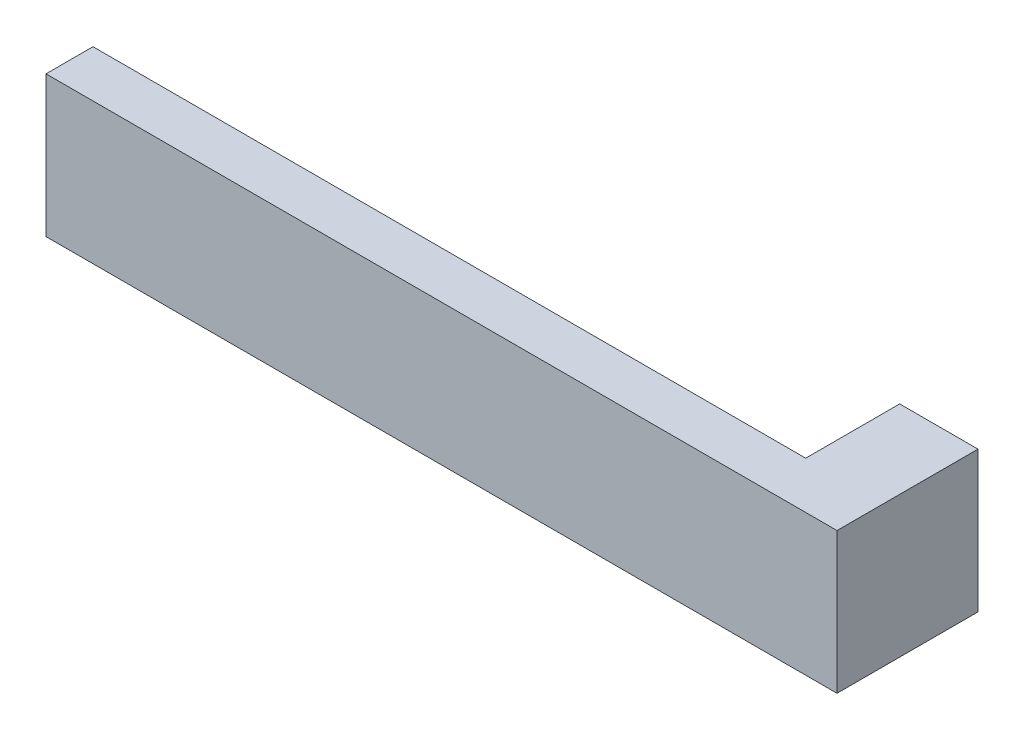
ISO-10303-21;
HEADER;
FILE_DESCRIPTION(('STEP AP214'),'2;1');
FILE_NAME('part.step','',(''),(''),'','','');
FILE_SCHEMA(('AUTOMOTIVE_DESIGN { 1 0 10303 214 1 1 1 1 }'));
ENDSEC;
DATA;
#1=APPLICATION_CONTEXT('core data for automotive mechanical design processes');
#2=APPLICATION_PROTOCOL_DEFINITION('international standard','automotive_design',2000,#1);
#3=PRODUCT_CONTEXT('',#1,'mechanical');
#4=PRODUCT('Part','Part','',(#3));
#5=PRODUCT_RELATED_PRODUCT_CATEGORY('part','',(#4));
#6=PRODUCT_DEFINITION_FORMATION('','',#4);
#7=PRODUCT_DEFINITION_CONTEXT('part definition',#1,'design');
#8=PRODUCT_DEFINITION('design','',#6,#7);
#9=PRODUCT_DEFINITION_SHAPE('','',#8);
#10=(LENGTH_UNIT() NAMED_UNIT(*) SI_UNIT(.MILLI.,.METRE.));
#11=(NAMED_UNIT(*) PLANE_ANGLE_UNIT() SI_UNIT($,.RADIAN.));
#12=(NAMED_UNIT(*) SI_UNIT($,.STERADIAN.) SOLID_ANGLE_UNIT());
#13=UNCERTAINTY_MEASURE_WITH_UNIT(LENGTH_MEASURE(1.E-05),#10,'distance_accuracy_value','');
#14=(GEOMETRIC_REPRESENTATION_CONTEXT(3) GLOBAL_UNCERTAINTY_ASSIGNED_CONTEXT((#13)) GLOBAL_UNIT_ASSIGNED_CONTEXT((#10,
#11,#12)) REPRESENTATION_CONTEXT('',''));
#15=CARTESIAN_POINT('',(0.,0.,0.));
#16=DIRECTION('',(0.,0.,1.));
#17=DIRECTION('',(1.,0.,0.));
#18=AXIS2_PLACEMENT_3D('',#15,#16,#17);
#19=CARTESIAN_POINT('',(-11.9274285384694,9.,21.));
#20=DIRECTION('',(0.,0.,-1.));
#21=DIRECTION('',(-1.,0.,0.));
#22=AXIS2_PLACEMENT_3D('',#19,#20,#21);
#23=PLANE('',#22);
#24=DIRECTION('',(1.,0.,0.));
#25=VECTOR('',#24,1.);
#26=CARTESIAN_POINT('',(-11.9274285384694,0.,21.));
#27=LINE('',#26,#25);
#28=CARTESIAN_POINT('',(-11.9274285384694,0.,21.));
#29=VERTEX_POINT('',#28);
#30=CARTESIAN_POINT('',(38.5725714615306,0.,21.));
#31=VERTEX_POINT('',#30);
#32=EDGE_CURVE('E134',#29,#31,#27,.T.);
#33=ORIENTED_EDGE('',*,*,#32,.T.);
#34=DIRECTION('',(0.,-1.,0.));
#35=VECTOR('',#34,1.);
#36=CARTESIAN_POINT('',(38.5725714615306,9.,21.));
#37=LINE('',#36,#35);
#38=CARTESIAN_POINT('',(38.5725714615306,9.,21.));
#39=VERTEX_POINT('',#38);
#40=EDGE_CURVE('E11',#39,#31,#37,.T.);
#41=ORIENTED_EDGE('',*,*,#40,.F.);
#42=DIRECTION('',(1.,0.,0.));
#43=VECTOR('',#42,1.);
#44=CARTESIAN_POINT('',(-11.9274285384694,9.,21.));
#45=LINE('',#44,#43);
#46=CARTESIAN_POINT('',(-11.9274285384694,9.,21.));
#47=VERTEX_POINT('',#46);
#48=EDGE_CURVE('E150',#47,#39,#45,.T.);
#49=ORIENTED_EDGE('',*,*,#48,.F.);
#50=DIRECTION('',(0.,-1.,0.));
#51=VECTOR('',#50,1.);
#52=CARTESIAN_POINT('',(-11.9274285384694,9.,21.));
#53=LINE('',#52,#51);
#54=EDGE_CURVE('E130',#47,#29,#53,.T.);
#55=ORIENTED_EDGE('',*,*,#54,.T.);
#56=EDGE_LOOP('',(#33,#41,#49,#55));
#57=FACE_BOUND('',#56,.T.);
#58=ADVANCED_FACE('F45',(#57),#23,.F.);
#59=CARTESIAN_POINT('',(38.5725714615306,9.,21.));
#60=DIRECTION('',(-1.,0.,0.));
#61=DIRECTION('',(0.,0.,1.));
#62=AXIS2_PLACEMENT_3D('',#59,#60,#61);
#63=PLANE('',#62);
#64=DIRECTION('',(0.,0.,-1.));
#65=VECTOR('',#64,1.);
#66=CARTESIAN_POINT('',(38.5725714615306,0.,21.));
#67=LINE('',#66,#65);
#68=CARTESIAN_POINT('',(38.5725714615306,0.,12.));
#69=VERTEX_POINT('',#68);
#70=EDGE_CURVE('E138',#31,#69,#67,.T.);
#71=ORIENTED_EDGE('',*,*,#70,.T.);
#72=DIRECTION('',(0.,-1.,0.));
#73=VECTOR('',#72,1.);
#74=CARTESIAN_POINT('',(38.5725714615306,9.,12.));
#75=LINE('',#74,#73);
#76=CARTESIAN_POINT('',(38.5725714615306,9.,12.));
#77=VERTEX_POINT('',#76);
#78=EDGE_CURVE('E54',#77,#69,#75,.T.);
#79=ORIENTED_EDGE('',*,*,#78,.F.);
#80=DIRECTION('',(0.,0.,-1.));
#81=VECTOR('',#80,1.);
#82=CARTESIAN_POINT('',(38.5725714615306,9.,21.));
#83=LINE('',#82,#81);
#84=EDGE_CURVE('E99',#39,#77,#83,.T.);
#85=ORIENTED_EDGE('',*,*,#84,.F.);
#86=ORIENTED_EDGE('',*,*,#40,.T.);
#87=EDGE_LOOP('',(#71,#79,#85,#86));
#88=FACE_BOUND('',#87,.T.);
#89=ADVANCED_FACE('F178',(#88),#63,.F.);
#90=CARTESIAN_POINT('',(38.5725714615306,9.,12.));
#91=DIRECTION('',(0.,0.,1.));
#92=DIRECTION('',(1.,0.,0.));
#93=AXIS2_PLACEMENT_3D('',#90,#91,#92);
#94=PLANE('',#93);
#95=DIRECTION('',(-1.,0.,0.));
#96=VECTOR('',#95,1.);
#97=CARTESIAN_POINT('',(38.5725714615306,0.,12.));
#98=LINE('',#97,#96);
#99=CARTESIAN_POINT('',(33.5725714615306,0.,12.));
#100=VERTEX_POINT('',#99);
#101=EDGE_CURVE('E141',#69,#100,#98,.T.);
#102=ORIENTED_EDGE('',*,*,#101,.T.);
#103=DIRECTION('',(0.,-1.,0.));
#104=VECTOR('',#103,1.);
#105=CARTESIAN_POINT('',(33.5725714615306,9.,12.));
#106=LINE('',#105,#104);
#107=CARTESIAN_POINT('',(33.5725714615306,9.,12.));
#108=VERTEX_POINT('',#107);
#109=EDGE_CURVE('E123',#108,#100,#106,.T.);
#110=ORIENTED_EDGE('',*,*,#109,.F.);
#111=DIRECTION('',(-1.,0.,0.));
#112=VECTOR('',#111,1.);
#113=CARTESIAN_POINT('',(38.5725714615306,9.,12.));
#114=LINE('',#113,#112);
#115=EDGE_CURVE('E112',#77,#108,#114,.T.);
#116=ORIENTED_EDGE('',*,*,#115,.F.);
#117=ORIENTED_EDGE('',*,*,#78,.T.);
#118=EDGE_LOOP('',(#102,#110,#116,#117));
#119=FACE_BOUND('',#118,.T.);
#120=ADVANCED_FACE('F160',(#119),#94,.F.);
#121=CARTESIAN_POINT('',(33.5725714615306,9.,12.));
#122=DIRECTION('',(1.,0.,0.));
#123=DIRECTION('',(0.,0.,-1.));
#124=AXIS2_PLACEMENT_3D('',#121,#122,#123);
#125=PLANE('',#124);
#126=DIRECTION('',(0.,0.,1.));
#127=VECTOR('',#126,1.);
#128=CARTESIAN_POINT('',(33.5725714615306,0.,12.));
#129=LINE('',#128,#127);
#130=CARTESIAN_POINT('',(33.5725714615306,0.,18.));
#131=VERTEX_POINT('',#130);
#132=EDGE_CURVE('E121',#100,#131,#129,.T.);
#133=ORIENTED_EDGE('',*,*,#132,.T.);
#134=DIRECTION('',(0.,-1.,0.));
#135=VECTOR('',#134,1.);
#136=CARTESIAN_POINT('',(33.5725714615306,9.,18.));
#137=LINE('',#136,#135);
#138=CARTESIAN_POINT('',(33.5725714615306,9.,18.));
#139=VERTEX_POINT('',#138);
#140=EDGE_CURVE('E118',#139,#131,#137,.T.);
#141=ORIENTED_EDGE('',*,*,#140,.F.);
#142=DIRECTION('',(0.,0.,1.));
#143=VECTOR('',#142,1.);
#144=CARTESIAN_POINT('',(33.5725714615306,9.,12.));
#145=LINE('',#144,#143);
#146=EDGE_CURVE('E106',#108,#139,#145,.T.);
#147=ORIENTED_EDGE('',*,*,#146,.F.);
#148=ORIENTED_EDGE('',*,*,#109,.T.);
#149=EDGE_LOOP('',(#133,#141,#147,#148));
#150=FACE_BOUND('',#149,.T.);
#151=ADVANCED_FACE('F119',(#150),#125,.F.);
#152=CARTESIAN_POINT('',(33.5725714615306,9.,18.));
#153=DIRECTION('',(0.,0.,1.));
#154=DIRECTION('',(1.,0.,0.));
#155=AXIS2_PLACEMENT_3D('',#152,#153,#154);
#156=PLANE('',#155);
#157=DIRECTION('',(-1.,0.,0.));
#158=VECTOR('',#157,1.);
#159=CARTESIAN_POINT('',(33.5725714615306,0.,18.));
#160=LINE('',#159,#158);
#161=CARTESIAN_POINT('',(-11.9274285384694,0.,18.));
#162=VERTEX_POINT('',#161);
#163=EDGE_CURVE('E85',#131,#162,#160,.T.);
#164=ORIENTED_EDGE('',*,*,#163,.T.);
#165=DIRECTION('',(0.,-1.,0.));
#166=VECTOR('',#165,1.);
#167=CARTESIAN_POINT('',(-11.9274285384694,9.,18.));
#168=LINE('',#167,#166);
#169=CARTESIAN_POINT('',(-11.9274285384694,9.,18.));
#170=VERTEX_POINT('',#169);
#171=EDGE_CURVE('E124',#170,#162,#168,.T.);
#172=ORIENTED_EDGE('',*,*,#171,.F.);
#173=DIRECTION('',(-1.,0.,0.));
#174=VECTOR('',#173,1.);
#175=CARTESIAN_POINT('',(33.5725714615306,9.,18.));
#176=LINE('',#175,#174);
#177=EDGE_CURVE('E110',#139,#170,#176,.T.);
#178=ORIENTED_EDGE('',*,*,#177,.F.);
#179=ORIENTED_EDGE('',*,*,#140,.T.);
#180=EDGE_LOOP('',(#164,#172,#178,#179));
#181=FACE_BOUND('',#180,.T.);
#182=ADVANCED_FACE('F126',(#181),#156,.F.);
#183=CARTESIAN_POINT('',(-11.9274285384694,9.,18.));
#184=DIRECTION('',(1.,0.,0.));
#185=DIRECTION('',(0.,0.,-1.));
#186=AXIS2_PLACEMENT_3D('',#183,#184,#185);
#187=PLANE('',#186);
#188=DIRECTION('',(0.,0.,1.));
#189=VECTOR('',#188,1.);
#190=CARTESIAN_POINT('',(-11.9274285384694,0.,18.));
#191=LINE('',#190,#189);
#192=EDGE_CURVE('E91',#162,#29,#191,.T.);
#193=ORIENTED_EDGE('',*,*,#192,.T.);
#194=ORIENTED_EDGE('',*,*,#54,.F.);
#195=DIRECTION('',(0.,0.,1.));
#196=VECTOR('',#195,1.);
#197=CARTESIAN_POINT('',(-11.9274285384694,9.,18.));
#198=LINE('',#197,#196);
#199=EDGE_CURVE('E62',#170,#47,#198,.T.);
#200=ORIENTED_EDGE('',*,*,#199,.F.);
#201=ORIENTED_EDGE('',*,*,#171,.T.);
#202=EDGE_LOOP('',(#193,#194,#200,#201));
#203=FACE_BOUND('',#202,.T.);
#204=ADVANCED_FACE('F167',(#203),#187,.F.);
#205=CARTESIAN_POINT('',(0.,9.,0.));
#206=DIRECTION('',(0.,1.,0.));
#207=DIRECTION('',(0.,0.,1.));
#208=AXIS2_PLACEMENT_3D('',#205,#206,#207);
#209=PLANE('',#208);
#210=ORIENTED_EDGE('',*,*,#48,.T.);
#211=ORIENTED_EDGE('',*,*,#84,.T.);
#212=ORIENTED_EDGE('',*,*,#115,.T.);
#213=ORIENTED_EDGE('',*,*,#146,.T.);
#214=ORIENTED_EDGE('',*,*,#177,.T.);
#215=ORIENTED_EDGE('',*,*,#199,.T.);
#216=EDGE_LOOP('',(#210,#211,#212,#213,#214,#215));
#217=FACE_BOUND('',#216,.T.);
#218=ADVANCED_FACE('F108',(#217),#209,.T.);
#219=CARTESIAN_POINT('',(0.,0.,0.));
#220=DIRECTION('',(0.,1.,0.));
#221=DIRECTION('',(0.,0.,1.));
#222=AXIS2_PLACEMENT_3D('',#219,#220,#221);
#223=PLANE('',#222);
#224=ORIENTED_EDGE('',*,*,#32,.F.);
#225=ORIENTED_EDGE('',*,*,#192,.F.);
#226=ORIENTED_EDGE('',*,*,#163,.F.);
#227=ORIENTED_EDGE('',*,*,#132,.F.);
#228=ORIENTED_EDGE('',*,*,#101,.F.);
#229=ORIENTED_EDGE('',*,*,#70,.F.);
#230=EDGE_LOOP('',(#224,#225,#226,#227,#228,#229));
#231=FACE_BOUND('',#230,.T.);
#232=ADVANCED_FACE('F163',(#231),#223,.F.);
#233=CLOSED_SHELL('',(#58,#89,#120,#151,#182,#204,#218,#232));
#234=MANIFOLD_SOLID_BREP('B2',#233);
#235=ADVANCED_BREP_SHAPE_REPRESENTATION('',(#18,#234),#14);
#236=SHAPE_DEFINITION_REPRESENTATION(#9,#235);
ENDSEC;
END-ISO-10303-21;
